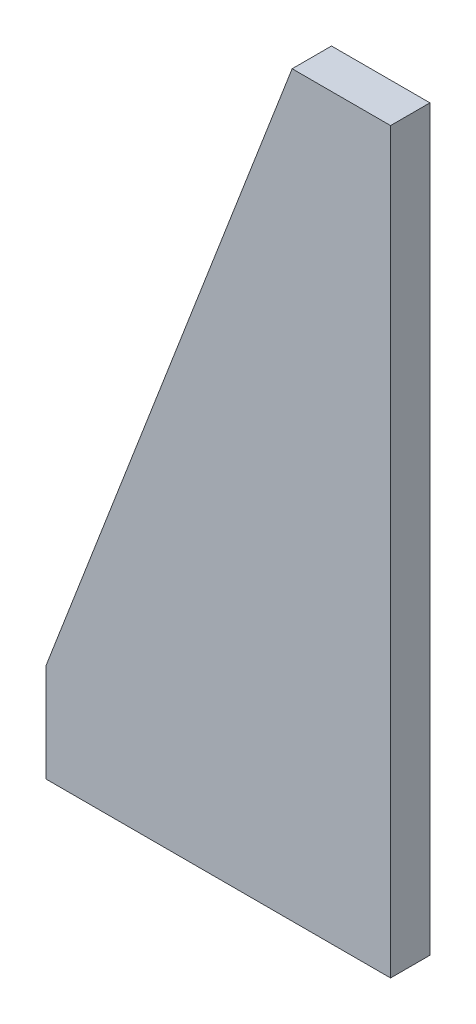
ISO-10303-21;
HEADER;
FILE_DESCRIPTION(('STEP AP214'),'2;1');
FILE_NAME('part.step','',(''),(''),'','','');
FILE_SCHEMA(('AUTOMOTIVE_DESIGN { 1 0 10303 214 1 1 1 1 }'));
ENDSEC;
DATA;
#1=APPLICATION_CONTEXT('core data for automotive mechanical design processes');
#2=APPLICATION_PROTOCOL_DEFINITION('international standard','automotive_design',2000,#1);
#3=PRODUCT_CONTEXT('',#1,'mechanical');
#4=PRODUCT('Part','Part','',(#3));
#5=PRODUCT_RELATED_PRODUCT_CATEGORY('part','',(#4));
#6=PRODUCT_DEFINITION_FORMATION('','',#4);
#7=PRODUCT_DEFINITION_CONTEXT('part definition',#1,'design');
#8=PRODUCT_DEFINITION('design','',#6,#7);
#9=PRODUCT_DEFINITION_SHAPE('','',#8);
#10=(LENGTH_UNIT() NAMED_UNIT(*) SI_UNIT(.MILLI.,.METRE.));
#11=(NAMED_UNIT(*) PLANE_ANGLE_UNIT() SI_UNIT($,.RADIAN.));
#12=(NAMED_UNIT(*) SI_UNIT($,.STERADIAN.) SOLID_ANGLE_UNIT());
#13=UNCERTAINTY_MEASURE_WITH_UNIT(LENGTH_MEASURE(1.E-05),#10,'distance_accuracy_value','');
#14=(GEOMETRIC_REPRESENTATION_CONTEXT(3) GLOBAL_UNCERTAINTY_ASSIGNED_CONTEXT((#13)) GLOBAL_UNIT_ASSIGNED_CONTEXT((#10,
#11,#12)) REPRESENTATION_CONTEXT('',''));
#15=CARTESIAN_POINT('',(0.,0.,0.));
#16=DIRECTION('',(0.,0.,1.));
#17=DIRECTION('',(1.,0.,0.));
#18=AXIS2_PLACEMENT_3D('',#15,#16,#17);
#19=CARTESIAN_POINT('',(0.,0.,-8.00000000000001));
#20=DIRECTION('',(0.,-1.,0.));
#21=DIRECTION('',(0.,0.,-0.999999999999995));
#22=AXIS2_PLACEMENT_3D('',#19,#20,#21);
#23=PLANE('',#22);
#24=DIRECTION('',(1.,0.,0.));
#25=VECTOR('',#24,1.);
#26=CARTESIAN_POINT('',(0.,0.,0.));
#27=LINE('',#26,#25);
#28=CARTESIAN_POINT('',(0.,0.,0.));
#29=VERTEX_POINT('',#28);
#30=CARTESIAN_POINT('',(70.0000000000003,0.,0.));
#31=VERTEX_POINT('',#30);
#32=EDGE_CURVE('E113',#29,#31,#27,.T.);
#33=ORIENTED_EDGE('',*,*,#32,.F.);
#34=DIRECTION('',(0.,0.,0.999999999999995));
#35=VECTOR('',#34,1.);
#36=CARTESIAN_POINT('',(0.,0.,-8.00000000000001));
#37=LINE('',#36,#35);
#38=CARTESIAN_POINT('',(0.,0.,-8.00000000000001));
#39=VERTEX_POINT('',#38);
#40=EDGE_CURVE('E11',#39,#29,#37,.T.);
#41=ORIENTED_EDGE('',*,*,#40,.F.);
#42=DIRECTION('',(1.,0.,0.));
#43=VECTOR('',#42,1.);
#44=CARTESIAN_POINT('',(0.,0.,-8.00000000000001));
#45=LINE('',#44,#43);
#46=CARTESIAN_POINT('',(70.0000000000003,0.,-8.));
#47=VERTEX_POINT('',#46);
#48=EDGE_CURVE('E108',#39,#47,#45,.T.);
#49=ORIENTED_EDGE('',*,*,#48,.T.);
#50=DIRECTION('',(0.,0.,0.999999999999995));
#51=VECTOR('',#50,1.);
#52=CARTESIAN_POINT('',(70.0000000000003,0.,-8.));
#53=LINE('',#52,#51);
#54=EDGE_CURVE('E39',#47,#31,#53,.T.);
#55=ORIENTED_EDGE('',*,*,#54,.T.);
#56=EDGE_LOOP('',(#33,#41,#49,#55));
#57=FACE_BOUND('',#56,.T.);
#58=ADVANCED_FACE('F36',(#57),#23,.T.);
#59=CARTESIAN_POINT('',(0.,20.,-8.));
#60=DIRECTION('',(-1.,0.,0.));
#61=DIRECTION('',(0.,-1.,0.));
#62=AXIS2_PLACEMENT_3D('',#59,#60,#61);
#63=PLANE('',#62);
#64=DIRECTION('',(0.,-1.,0.));
#65=VECTOR('',#64,1.);
#66=CARTESIAN_POINT('',(0.,20.,0.));
#67=LINE('',#66,#65);
#68=CARTESIAN_POINT('',(0.,20.,0.));
#69=VERTEX_POINT('',#68);
#70=EDGE_CURVE('E122',#69,#29,#67,.T.);
#71=ORIENTED_EDGE('',*,*,#70,.F.);
#72=DIRECTION('',(0.,0.,0.999999999999995));
#73=VECTOR('',#72,1.);
#74=CARTESIAN_POINT('',(0.,20.,-8.));
#75=LINE('',#74,#73);
#76=CARTESIAN_POINT('',(0.,20.,-8.));
#77=VERTEX_POINT('',#76);
#78=EDGE_CURVE('E45',#77,#69,#75,.T.);
#79=ORIENTED_EDGE('',*,*,#78,.F.);
#80=DIRECTION('',(0.,-1.,0.));
#81=VECTOR('',#80,1.);
#82=CARTESIAN_POINT('',(0.,20.,-8.));
#83=LINE('',#82,#81);
#84=EDGE_CURVE('E103',#77,#39,#83,.T.);
#85=ORIENTED_EDGE('',*,*,#84,.T.);
#86=ORIENTED_EDGE('',*,*,#40,.T.);
#87=EDGE_LOOP('',(#71,#79,#85,#86));
#88=FACE_BOUND('',#87,.T.);
#89=ADVANCED_FACE('F128',(#88),#63,.T.);
#90=CARTESIAN_POINT('',(49.9999999999998,150.,-8.));
#91=DIRECTION('',(-0.93334560620306,0.358979079308869,0.));
#92=DIRECTION('',(-0.35897907930887,-0.93334560620306,0.));
#93=AXIS2_PLACEMENT_3D('',#90,#91,#92);
#94=PLANE('',#93);
#95=DIRECTION('',(-0.35897907930887,-0.93334560620306,0.));
#96=VECTOR('',#95,1.);
#97=CARTESIAN_POINT('',(49.9999999999998,150.,0.));
#98=LINE('',#97,#96);
#99=CARTESIAN_POINT('',(49.9999999999998,150.,0.));
#100=VERTEX_POINT('',#99);
#101=EDGE_CURVE('E92',#100,#69,#98,.T.);
#102=ORIENTED_EDGE('',*,*,#101,.F.);
#103=DIRECTION('',(0.,0.,0.999999999999995));
#104=VECTOR('',#103,1.);
#105=CARTESIAN_POINT('',(49.9999999999998,150.,-8.));
#106=LINE('',#105,#104);
#107=CARTESIAN_POINT('',(49.9999999999998,150.,-8.));
#108=VERTEX_POINT('',#107);
#109=EDGE_CURVE('E87',#108,#100,#106,.T.);
#110=ORIENTED_EDGE('',*,*,#109,.F.);
#111=DIRECTION('',(-0.35897907930887,-0.93334560620306,0.));
#112=VECTOR('',#111,1.);
#113=CARTESIAN_POINT('',(49.9999999999998,150.,-8.));
#114=LINE('',#113,#112);
#115=EDGE_CURVE('E90',#108,#77,#114,.T.);
#116=ORIENTED_EDGE('',*,*,#115,.T.);
#117=ORIENTED_EDGE('',*,*,#78,.T.);
#118=EDGE_LOOP('',(#102,#110,#116,#117));
#119=FACE_BOUND('',#118,.T.);
#120=ADVANCED_FACE('F89',(#119),#94,.T.);
#121=CARTESIAN_POINT('',(70.0000000000003,150.,-8.));
#122=DIRECTION('',(0.,1.,0.));
#123=DIRECTION('',(-1.,0.,0.));
#124=AXIS2_PLACEMENT_3D('',#121,#122,#123);
#125=PLANE('',#124);
#126=DIRECTION('',(-1.,0.,0.));
#127=VECTOR('',#126,1.);
#128=CARTESIAN_POINT('',(70.0000000000003,150.,0.));
#129=LINE('',#128,#127);
#130=CARTESIAN_POINT('',(70.0000000000003,150.,0.));
#131=VERTEX_POINT('',#130);
#132=EDGE_CURVE('E119',#131,#100,#129,.T.);
#133=ORIENTED_EDGE('',*,*,#132,.F.);
#134=DIRECTION('',(0.,0.,0.999999999999995));
#135=VECTOR('',#134,1.);
#136=CARTESIAN_POINT('',(70.0000000000003,150.,-8.));
#137=LINE('',#136,#135);
#138=CARTESIAN_POINT('',(70.0000000000003,150.,-8.));
#139=VERTEX_POINT('',#138);
#140=EDGE_CURVE('E97',#139,#131,#137,.T.);
#141=ORIENTED_EDGE('',*,*,#140,.F.);
#142=DIRECTION('',(-1.,0.,0.));
#143=VECTOR('',#142,1.);
#144=CARTESIAN_POINT('',(70.0000000000003,150.,-8.));
#145=LINE('',#144,#143);
#146=EDGE_CURVE('E102',#139,#108,#145,.T.);
#147=ORIENTED_EDGE('',*,*,#146,.T.);
#148=ORIENTED_EDGE('',*,*,#109,.T.);
#149=EDGE_LOOP('',(#133,#141,#147,#148));
#150=FACE_BOUND('',#149,.T.);
#151=ADVANCED_FACE('F105',(#150),#125,.T.);
#152=CARTESIAN_POINT('',(70.0000000000003,0.,-8.));
#153=DIRECTION('',(1.,0.,0.));
#154=DIRECTION('',(0.,0.,-0.999999999999995));
#155=AXIS2_PLACEMENT_3D('',#152,#153,#154);
#156=PLANE('',#155);
#157=DIRECTION('',(0.,1.,0.));
#158=VECTOR('',#157,1.);
#159=CARTESIAN_POINT('',(70.0000000000003,0.,0.));
#160=LINE('',#159,#158);
#161=EDGE_CURVE('E116',#31,#131,#160,.T.);
#162=ORIENTED_EDGE('',*,*,#161,.F.);
#163=ORIENTED_EDGE('',*,*,#54,.F.);
#164=DIRECTION('',(0.,1.,0.));
#165=VECTOR('',#164,1.);
#166=CARTESIAN_POINT('',(70.0000000000003,0.,-8.));
#167=LINE('',#166,#165);
#168=EDGE_CURVE('E106',#47,#139,#167,.T.);
#169=ORIENTED_EDGE('',*,*,#168,.T.);
#170=ORIENTED_EDGE('',*,*,#140,.T.);
#171=EDGE_LOOP('',(#162,#163,#169,#170));
#172=FACE_BOUND('',#171,.T.);
#173=ADVANCED_FACE('F125',(#172),#156,.T.);
#174=CARTESIAN_POINT('',(0.,0.,-8.00000000000001));
#175=DIRECTION('',(0.,0.,0.999999999999995));
#176=DIRECTION('',(1.,0.,0.));
#177=AXIS2_PLACEMENT_3D('',#174,#175,#176);
#178=PLANE('',#177);
#179=ORIENTED_EDGE('',*,*,#48,.F.);
#180=ORIENTED_EDGE('',*,*,#84,.F.);
#181=ORIENTED_EDGE('',*,*,#115,.F.);
#182=ORIENTED_EDGE('',*,*,#146,.F.);
#183=ORIENTED_EDGE('',*,*,#168,.F.);
#184=EDGE_LOOP('',(#179,#180,#181,#182,#183));
#185=FACE_BOUND('',#184,.T.);
#186=ADVANCED_FACE('F101',(#185),#178,.F.);
#187=CARTESIAN_POINT('',(0.,0.,0.));
#188=DIRECTION('',(0.,0.,0.999999999999995));
#189=DIRECTION('',(1.,0.,0.));
#190=AXIS2_PLACEMENT_3D('',#187,#188,#189);
#191=PLANE('',#190);
#192=ORIENTED_EDGE('',*,*,#32,.T.);
#193=ORIENTED_EDGE('',*,*,#161,.T.);
#194=ORIENTED_EDGE('',*,*,#132,.T.);
#195=ORIENTED_EDGE('',*,*,#101,.T.);
#196=ORIENTED_EDGE('',*,*,#70,.T.);
#197=EDGE_LOOP('',(#192,#193,#194,#195,#196));
#198=FACE_BOUND('',#197,.T.);
#199=ADVANCED_FACE('F127',(#198),#191,.T.);
#200=CLOSED_SHELL('',(#58,#89,#120,#151,#173,#186,#199));
#201=MANIFOLD_SOLID_BREP('B2',#200);
#202=ADVANCED_BREP_SHAPE_REPRESENTATION('',(#18,#201),#14);
#203=SHAPE_DEFINITION_REPRESENTATION(#9,#202);
ENDSEC;
END-ISO-10303-21;
